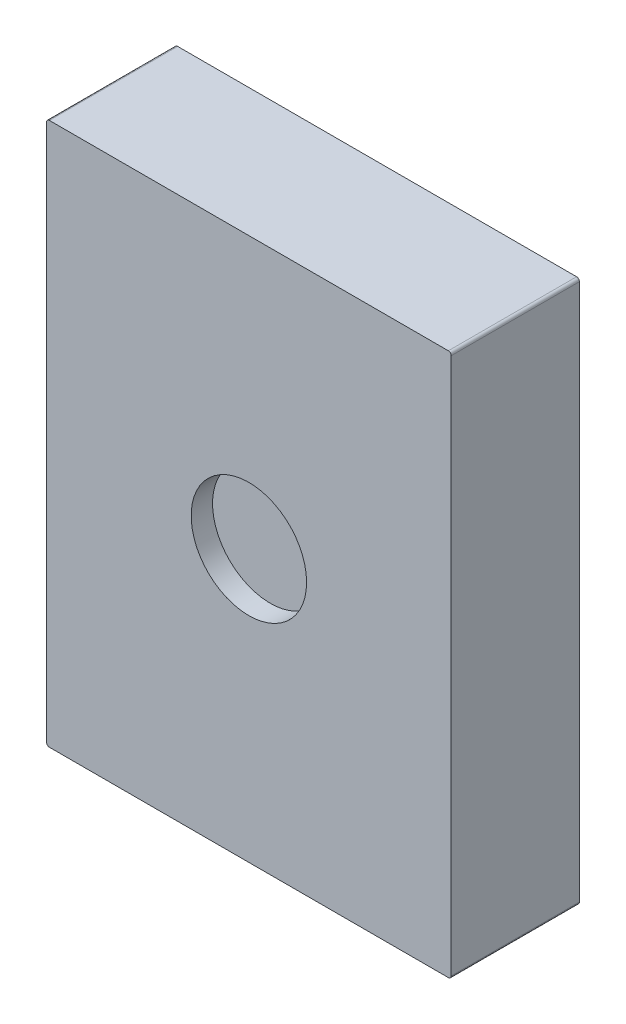
ISO-10303-21;
HEADER;
FILE_DESCRIPTION(('STEP AP214'),'2;1');
FILE_NAME('part.step','',(''),(''),'','','');
FILE_SCHEMA(('AUTOMOTIVE_DESIGN { 1 0 10303 214 1 1 1 1 }'));
ENDSEC;
DATA;
#1=APPLICATION_CONTEXT('core data for automotive mechanical design processes');
#2=APPLICATION_PROTOCOL_DEFINITION('international standard','automotive_design',2000,#1);
#3=PRODUCT_CONTEXT('',#1,'mechanical');
#4=PRODUCT('Part','Part','',(#3));
#5=PRODUCT_RELATED_PRODUCT_CATEGORY('part','',(#4));
#6=PRODUCT_DEFINITION_FORMATION('','',#4);
#7=PRODUCT_DEFINITION_CONTEXT('part definition',#1,'design');
#8=PRODUCT_DEFINITION('design','',#6,#7);
#9=PRODUCT_DEFINITION_SHAPE('','',#8);
#10=(LENGTH_UNIT() NAMED_UNIT(*) SI_UNIT(.MILLI.,.METRE.));
#11=(NAMED_UNIT(*) PLANE_ANGLE_UNIT() SI_UNIT($,.RADIAN.));
#12=(NAMED_UNIT(*) SI_UNIT($,.STERADIAN.) SOLID_ANGLE_UNIT());
#13=UNCERTAINTY_MEASURE_WITH_UNIT(LENGTH_MEASURE(1.E-05),#10,'distance_accuracy_value','');
#14=(GEOMETRIC_REPRESENTATION_CONTEXT(3) GLOBAL_UNCERTAINTY_ASSIGNED_CONTEXT((#13)) GLOBAL_UNIT_ASSIGNED_CONTEXT((#10,
#11,#12)) REPRESENTATION_CONTEXT('',''));
#15=CARTESIAN_POINT('',(0.,0.,0.));
#16=DIRECTION('',(0.,0.,1.));
#17=DIRECTION('',(1.,0.,0.));
#18=AXIS2_PLACEMENT_3D('',#15,#16,#17);
#19=CARTESIAN_POINT('',(-142.,-190.5,60.));
#20=DIRECTION('',(0.,1.,0.));
#21=DIRECTION('',(0.,0.,1.));
#22=AXIS2_PLACEMENT_3D('',#19,#20,#21);
#23=PLANE('',#22);
#24=DIRECTION('',(1.,0.,0.));
#25=VECTOR('',#24,1.);
#26=CARTESIAN_POINT('',(-142.,-190.5,90.));
#27=LINE('',#26,#25);
#28=CARTESIAN_POINT('',(-140.,-190.5,90.));
#29=VERTEX_POINT('',#28);
#30=CARTESIAN_POINT('',(140.,-190.5,90.));
#31=VERTEX_POINT('',#30);
#32=EDGE_CURVE('E206',#29,#31,#27,.T.);
#33=ORIENTED_EDGE('',*,*,#32,.F.);
#34=DIRECTION('',(0.,0.,-1.));
#35=VECTOR('',#34,1.);
#36=CARTESIAN_POINT('',(-140.,-190.5,60.));
#37=LINE('',#36,#35);
#38=CARTESIAN_POINT('',(-140.,-190.5,0.));
#39=VERTEX_POINT('',#38);
#40=EDGE_CURVE('E234',#29,#39,#37,.T.);
#41=ORIENTED_EDGE('',*,*,#40,.T.);
#42=DIRECTION('',(1.,0.,0.));
#43=VECTOR('',#42,1.);
#44=CARTESIAN_POINT('',(-142.,-190.5,0.));
#45=LINE('',#44,#43);
#46=CARTESIAN_POINT('',(140.,-190.5,0.));
#47=VERTEX_POINT('',#46);
#48=EDGE_CURVE('E227',#39,#47,#45,.T.);
#49=ORIENTED_EDGE('',*,*,#48,.T.);
#50=DIRECTION('',(0.,0.,-1.));
#51=VECTOR('',#50,1.);
#52=CARTESIAN_POINT('',(140.,-190.5,60.));
#53=LINE('',#52,#51);
#54=EDGE_CURVE('E231',#47,#31,#53,.F.);
#55=ORIENTED_EDGE('',*,*,#54,.T.);
#56=EDGE_LOOP('',(#33,#41,#49,#55));
#57=FACE_BOUND('',#56,.T.);
#58=DIRECTION('',(1.,0.,0.));
#59=VECTOR('',#58,1.);
#60=CARTESIAN_POINT('',(-142.,-190.5,10.));
#61=LINE('',#60,#59);
#62=CARTESIAN_POINT('',(-132.,-190.5,10.));
#63=VERTEX_POINT('',#62);
#64=CARTESIAN_POINT('',(132.,-190.5,10.));
#65=VERTEX_POINT('',#64);
#66=EDGE_CURVE('E174',#63,#65,#61,.T.);
#67=ORIENTED_EDGE('',*,*,#66,.F.);
#68=DIRECTION('',(0.,0.,-1.));
#69=VECTOR('',#68,1.);
#70=CARTESIAN_POINT('',(-132.,-190.5,60.));
#71=LINE('',#70,#69);
#72=CARTESIAN_POINT('',(-132.,-190.5,80.));
#73=VERTEX_POINT('',#72);
#74=EDGE_CURVE('E187',#73,#63,#71,.T.);
#75=ORIENTED_EDGE('',*,*,#74,.F.);
#76=DIRECTION('',(1.,0.,0.));
#77=VECTOR('',#76,1.);
#78=CARTESIAN_POINT('',(-142.,-190.5,80.));
#79=LINE('',#78,#77);
#80=CARTESIAN_POINT('',(132.,-190.5,80.));
#81=VERTEX_POINT('',#80);
#82=EDGE_CURVE('E159',#73,#81,#79,.T.);
#83=ORIENTED_EDGE('',*,*,#82,.T.);
#84=DIRECTION('',(0.,0.,-1.));
#85=VECTOR('',#84,1.);
#86=CARTESIAN_POINT('',(132.,-190.5,60.));
#87=LINE('',#86,#85);
#88=EDGE_CURVE('E154',#81,#65,#87,.T.);
#89=ORIENTED_EDGE('',*,*,#88,.T.);
#90=EDGE_LOOP('',(#67,#75,#83,#89));
#91=FACE_BOUND('',#90,.T.);
#92=ADVANCED_FACE('F44',(#57,#91),#23,.F.);
#93=CARTESIAN_POINT('',(142.,190.5,60.));
#94=DIRECTION('',(-1.,0.,0.));
#95=DIRECTION('',(0.,-1.,0.));
#96=AXIS2_PLACEMENT_3D('',#93,#94,#95);
#97=PLANE('',#96);
#98=DIRECTION('',(0.,1.,0.));
#99=VECTOR('',#98,1.);
#100=CARTESIAN_POINT('',(142.,190.5,90.));
#101=LINE('',#100,#99);
#102=CARTESIAN_POINT('',(142.,-188.5,90.));
#103=VERTEX_POINT('',#102);
#104=CARTESIAN_POINT('',(142.,188.5,90.));
#105=VERTEX_POINT('',#104);
#106=EDGE_CURVE('E210',#103,#105,#101,.T.);
#107=ORIENTED_EDGE('',*,*,#106,.F.);
#108=DIRECTION('',(0.,0.,-1.));
#109=VECTOR('',#108,1.);
#110=CARTESIAN_POINT('',(142.,-188.5,60.));
#111=LINE('',#110,#109);
#112=CARTESIAN_POINT('',(142.,-188.5,0.));
#113=VERTEX_POINT('',#112);
#114=EDGE_CURVE('E271',#103,#113,#111,.T.);
#115=ORIENTED_EDGE('',*,*,#114,.T.);
#116=DIRECTION('',(0.,1.,0.));
#117=VECTOR('',#116,1.);
#118=CARTESIAN_POINT('',(142.,190.5,0.));
#119=LINE('',#118,#117);
#120=CARTESIAN_POINT('',(142.,188.5,0.));
#121=VERTEX_POINT('',#120);
#122=EDGE_CURVE('E216',#113,#121,#119,.T.);
#123=ORIENTED_EDGE('',*,*,#122,.T.);
#124=DIRECTION('',(0.,0.,-1.));
#125=VECTOR('',#124,1.);
#126=CARTESIAN_POINT('',(142.,188.5,60.));
#127=LINE('',#126,#125);
#128=EDGE_CURVE('E268',#121,#105,#127,.F.);
#129=ORIENTED_EDGE('',*,*,#128,.T.);
#130=EDGE_LOOP('',(#107,#115,#123,#129));
#131=FACE_BOUND('',#130,.T.);
#132=ADVANCED_FACE('F286',(#131),#97,.F.);
#133=CARTESIAN_POINT('',(-142.,190.5,60.));
#134=DIRECTION('',(0.,-1.,0.));
#135=DIRECTION('',(0.,0.,-1.));
#136=AXIS2_PLACEMENT_3D('',#133,#134,#135);
#137=PLANE('',#136);
#138=DIRECTION('',(-1.,0.,0.));
#139=VECTOR('',#138,1.);
#140=CARTESIAN_POINT('',(-142.,190.5,90.));
#141=LINE('',#140,#139);
#142=CARTESIAN_POINT('',(140.,190.5,90.));
#143=VERTEX_POINT('',#142);
#144=CARTESIAN_POINT('',(-140.,190.5,90.));
#145=VERTEX_POINT('',#144);
#146=EDGE_CURVE('E213',#143,#145,#141,.T.);
#147=ORIENTED_EDGE('',*,*,#146,.F.);
#148=DIRECTION('',(0.,0.,-1.));
#149=VECTOR('',#148,1.);
#150=CARTESIAN_POINT('',(140.,190.5,60.));
#151=LINE('',#150,#149);
#152=CARTESIAN_POINT('',(140.,190.5,0.));
#153=VERTEX_POINT('',#152);
#154=EDGE_CURVE('E11',#143,#153,#151,.T.);
#155=ORIENTED_EDGE('',*,*,#154,.T.);
#156=DIRECTION('',(-1.,0.,0.));
#157=VECTOR('',#156,1.);
#158=CARTESIAN_POINT('',(-142.,190.5,0.));
#159=LINE('',#158,#157);
#160=CARTESIAN_POINT('',(-140.,190.5,0.));
#161=VERTEX_POINT('',#160);
#162=EDGE_CURVE('E220',#153,#161,#159,.T.);
#163=ORIENTED_EDGE('',*,*,#162,.T.);
#164=DIRECTION('',(0.,0.,-1.));
#165=VECTOR('',#164,1.);
#166=CARTESIAN_POINT('',(-140.,190.5,60.));
#167=LINE('',#166,#165);
#168=EDGE_CURVE('E53',#161,#145,#167,.F.);
#169=ORIENTED_EDGE('',*,*,#168,.T.);
#170=EDGE_LOOP('',(#147,#155,#163,#169));
#171=FACE_BOUND('',#170,.T.);
#172=ADVANCED_FACE('F293',(#171),#137,.F.);
#173=CARTESIAN_POINT('',(-142.,190.5,60.));
#174=DIRECTION('',(1.,0.,0.));
#175=DIRECTION('',(0.,1.,0.));
#176=AXIS2_PLACEMENT_3D('',#173,#174,#175);
#177=PLANE('',#176);
#178=DIRECTION('',(0.,-1.,0.));
#179=VECTOR('',#178,1.);
#180=CARTESIAN_POINT('',(-142.,190.5,0.));
#181=LINE('',#180,#179);
#182=CARTESIAN_POINT('',(-142.,188.5,0.));
#183=VERTEX_POINT('',#182);
#184=CARTESIAN_POINT('',(-142.,-188.5,0.));
#185=VERTEX_POINT('',#184);
#186=EDGE_CURVE('E223',#183,#185,#181,.T.);
#187=ORIENTED_EDGE('',*,*,#186,.T.);
#188=DIRECTION('',(0.,0.,-1.));
#189=VECTOR('',#188,1.);
#190=CARTESIAN_POINT('',(-142.,-188.5,60.));
#191=LINE('',#190,#189);
#192=CARTESIAN_POINT('',(-142.,-188.5,90.));
#193=VERTEX_POINT('',#192);
#194=EDGE_CURVE('E254',#185,#193,#191,.F.);
#195=ORIENTED_EDGE('',*,*,#194,.T.);
#196=DIRECTION('',(0.,-1.,0.));
#197=VECTOR('',#196,1.);
#198=CARTESIAN_POINT('',(-142.,190.5,90.));
#199=LINE('',#198,#197);
#200=CARTESIAN_POINT('',(-142.,188.5,90.));
#201=VERTEX_POINT('',#200);
#202=EDGE_CURVE('E199',#201,#193,#199,.T.);
#203=ORIENTED_EDGE('',*,*,#202,.F.);
#204=DIRECTION('',(0.,0.,-1.));
#205=VECTOR('',#204,1.);
#206=CARTESIAN_POINT('',(-142.,188.5,60.));
#207=LINE('',#206,#205);
#208=EDGE_CURVE('E250',#201,#183,#207,.T.);
#209=ORIENTED_EDGE('',*,*,#208,.T.);
#210=EDGE_LOOP('',(#187,#195,#203,#209));
#211=FACE_BOUND('',#210,.T.);
#212=ADVANCED_FACE('F301',(#211),#177,.F.);
#213=CARTESIAN_POINT('',(0.,0.,0.));
#214=DIRECTION('',(0.,0.,1.));
#215=DIRECTION('',(1.,0.,0.));
#216=AXIS2_PLACEMENT_3D('',#213,#214,#215);
#217=PLANE('',#216);
#218=ORIENTED_EDGE('',*,*,#48,.F.);
#219=CARTESIAN_POINT('',(-140.,-188.5,0.));
#220=DIRECTION('',(0.,0.,1.));
#221=DIRECTION('',(1.,0.,0.));
#222=AXIS2_PLACEMENT_3D('',#219,#220,#221);
#223=CIRCLE('',#222,2.);
#224=EDGE_CURVE('E247',#39,#185,#223,.F.);
#225=ORIENTED_EDGE('',*,*,#224,.T.);
#226=ORIENTED_EDGE('',*,*,#186,.F.);
#227=CARTESIAN_POINT('',(-140.,188.5,0.));
#228=DIRECTION('',(0.,0.,1.));
#229=DIRECTION('',(1.,0.,0.));
#230=AXIS2_PLACEMENT_3D('',#227,#228,#229);
#231=CIRCLE('',#230,2.);
#232=EDGE_CURVE('E238',#183,#161,#231,.F.);
#233=ORIENTED_EDGE('',*,*,#232,.T.);
#234=ORIENTED_EDGE('',*,*,#162,.F.);
#235=CARTESIAN_POINT('',(140.,188.5,0.));
#236=DIRECTION('',(0.,0.,1.));
#237=DIRECTION('',(1.,0.,0.));
#238=AXIS2_PLACEMENT_3D('',#235,#236,#237);
#239=CIRCLE('',#238,2.);
#240=EDGE_CURVE('E241',#153,#121,#239,.F.);
#241=ORIENTED_EDGE('',*,*,#240,.T.);
#242=ORIENTED_EDGE('',*,*,#122,.F.);
#243=CARTESIAN_POINT('',(140.,-188.5,0.));
#244=DIRECTION('',(0.,0.,1.));
#245=DIRECTION('',(1.,0.,0.));
#246=AXIS2_PLACEMENT_3D('',#243,#244,#245);
#247=CIRCLE('',#246,2.);
#248=EDGE_CURVE('E244',#113,#47,#247,.F.);
#249=ORIENTED_EDGE('',*,*,#248,.T.);
#250=EDGE_LOOP('',(#218,#225,#226,#233,#234,#241,#242,#249));
#251=FACE_BOUND('',#250,.T.);
#252=ADVANCED_FACE('F299',(#251),#217,.F.);
#253=CARTESIAN_POINT('',(0.,0.,90.));
#254=DIRECTION('',(0.,0.,1.));
#255=DIRECTION('',(1.,0.,0.));
#256=AXIS2_PLACEMENT_3D('',#253,#254,#255);
#257=PLANE('',#256);
#258=CARTESIAN_POINT('',(0.,0.,90.));
#259=DIRECTION('',(0.,0.,1.));
#260=DIRECTION('',(1.,0.,0.));
#261=AXIS2_PLACEMENT_3D('',#258,#259,#260);
#262=CIRCLE('',#261,40.5);
#263=CARTESIAN_POINT('',(40.5,0.,90.));
#264=VERTEX_POINT('',#263);
#265=EDGE_CURVE('E147',#264,#264,#262,.T.);
#266=ORIENTED_EDGE('',*,*,#265,.F.);
#267=EDGE_LOOP('',(#266));
#268=FACE_BOUND('',#267,.T.);
#269=ORIENTED_EDGE('',*,*,#202,.T.);
#270=CARTESIAN_POINT('',(-140.,-188.5,90.));
#271=DIRECTION('',(0.,0.,1.));
#272=DIRECTION('',(1.,0.,0.));
#273=AXIS2_PLACEMENT_3D('',#270,#271,#272);
#274=CIRCLE('',#273,2.);
#275=EDGE_CURVE('E265',#193,#29,#274,.T.);
#276=ORIENTED_EDGE('',*,*,#275,.T.);
#277=ORIENTED_EDGE('',*,*,#32,.T.);
#278=CARTESIAN_POINT('',(140.,-188.5,90.));
#279=DIRECTION('',(0.,0.,1.));
#280=DIRECTION('',(1.,0.,0.));
#281=AXIS2_PLACEMENT_3D('',#278,#279,#280);
#282=CIRCLE('',#281,2.);
#283=EDGE_CURVE('E262',#31,#103,#282,.T.);
#284=ORIENTED_EDGE('',*,*,#283,.T.);
#285=ORIENTED_EDGE('',*,*,#106,.T.);
#286=CARTESIAN_POINT('',(140.,188.5,90.));
#287=DIRECTION('',(0.,0.,1.));
#288=DIRECTION('',(1.,0.,0.));
#289=AXIS2_PLACEMENT_3D('',#286,#287,#288);
#290=CIRCLE('',#289,2.);
#291=EDGE_CURVE('E66',#105,#143,#290,.T.);
#292=ORIENTED_EDGE('',*,*,#291,.T.);
#293=ORIENTED_EDGE('',*,*,#146,.T.);
#294=CARTESIAN_POINT('',(-140.,188.5,90.));
#295=DIRECTION('',(0.,0.,1.));
#296=DIRECTION('',(1.,0.,0.));
#297=AXIS2_PLACEMENT_3D('',#294,#295,#296);
#298=CIRCLE('',#297,2.);
#299=EDGE_CURVE('E257',#145,#201,#298,.T.);
#300=ORIENTED_EDGE('',*,*,#299,.T.);
#301=EDGE_LOOP('',(#269,#276,#277,#284,#285,#292,#293,#300));
#302=FACE_BOUND('',#301,.T.);
#303=ADVANCED_FACE('F334',(#268,#302),#257,.T.);
#304=CARTESIAN_POINT('',(0.,0.,75.));
#305=DIRECTION('',(0.,0.,1.));
#306=DIRECTION('',(1.,0.,0.));
#307=AXIS2_PLACEMENT_3D('',#304,#305,#306);
#308=CYLINDRICAL_SURFACE('',#307,40.5);
#309=CARTESIAN_POINT('',(0.,0.,75.));
#310=DIRECTION('',(0.,0.,1.));
#311=DIRECTION('',(1.,0.,0.));
#312=AXIS2_PLACEMENT_3D('',#309,#310,#311);
#313=CIRCLE('',#312,40.5);
#314=CARTESIAN_POINT('',(40.5,0.,75.));
#315=VERTEX_POINT('',#314);
#316=EDGE_CURVE('E195',#315,#315,#313,.T.);
#317=ORIENTED_EDGE('',*,*,#316,.F.);
#318=EDGE_LOOP('',(#317));
#319=FACE_BOUND('',#318,.T.);
#320=ORIENTED_EDGE('',*,*,#265,.T.);
#321=EDGE_LOOP('',(#320));
#322=FACE_BOUND('',#321,.T.);
#323=ADVANCED_FACE('F341',(#319,#322),#308,.F.);
#324=CARTESIAN_POINT('',(0.,0.,75.));
#325=DIRECTION('',(0.,0.,1.));
#326=DIRECTION('',(1.,0.,0.));
#327=AXIS2_PLACEMENT_3D('',#324,#325,#326);
#328=PLANE('',#327);
#329=ORIENTED_EDGE('',*,*,#316,.T.);
#330=EDGE_LOOP('',(#329));
#331=FACE_BOUND('',#330,.T.);
#332=ADVANCED_FACE('F347',(#331),#328,.T.);
#333=CARTESIAN_POINT('',(132.,190.5,60.));
#334=DIRECTION('',(-1.,0.,0.));
#335=DIRECTION('',(0.,-1.,0.));
#336=AXIS2_PLACEMENT_3D('',#333,#334,#335);
#337=PLANE('',#336);
#338=DIRECTION('',(0.,1.,0.));
#339=VECTOR('',#338,1.);
#340=CARTESIAN_POINT('',(132.,190.5,10.));
#341=LINE('',#340,#339);
#342=CARTESIAN_POINT('',(132.,180.5,10.));
#343=VERTEX_POINT('',#342);
#344=EDGE_CURVE('E164',#65,#343,#341,.T.);
#345=ORIENTED_EDGE('',*,*,#344,.F.);
#346=ORIENTED_EDGE('',*,*,#88,.F.);
#347=DIRECTION('',(0.,1.,0.));
#348=VECTOR('',#347,1.);
#349=CARTESIAN_POINT('',(132.,190.5,80.));
#350=LINE('',#349,#348);
#351=CARTESIAN_POINT('',(132.,180.5,80.));
#352=VERTEX_POINT('',#351);
#353=EDGE_CURVE('E151',#81,#352,#350,.T.);
#354=ORIENTED_EDGE('',*,*,#353,.T.);
#355=DIRECTION('',(0.,0.,-1.));
#356=VECTOR('',#355,1.);
#357=CARTESIAN_POINT('',(132.,180.5,60.));
#358=LINE('',#357,#356);
#359=EDGE_CURVE('E135',#352,#343,#358,.T.);
#360=ORIENTED_EDGE('',*,*,#359,.T.);
#361=EDGE_LOOP('',(#345,#346,#354,#360));
#362=FACE_BOUND('',#361,.T.);
#363=ADVANCED_FACE('F152',(#362),#337,.T.);
#364=CARTESIAN_POINT('',(-142.,180.5,60.));
#365=DIRECTION('',(0.,-1.,0.));
#366=DIRECTION('',(0.,0.,-1.));
#367=AXIS2_PLACEMENT_3D('',#364,#365,#366);
#368=PLANE('',#367);
#369=DIRECTION('',(-1.,0.,0.));
#370=VECTOR('',#369,1.);
#371=CARTESIAN_POINT('',(-142.,180.5,10.));
#372=LINE('',#371,#370);
#373=CARTESIAN_POINT('',(-132.,180.5,10.));
#374=VERTEX_POINT('',#373);
#375=EDGE_CURVE('E142',#343,#374,#372,.T.);
#376=ORIENTED_EDGE('',*,*,#375,.F.);
#377=ORIENTED_EDGE('',*,*,#359,.F.);
#378=DIRECTION('',(-1.,0.,0.));
#379=VECTOR('',#378,1.);
#380=CARTESIAN_POINT('',(-142.,180.5,80.));
#381=LINE('',#380,#379);
#382=CARTESIAN_POINT('',(-132.,180.5,80.));
#383=VERTEX_POINT('',#382);
#384=EDGE_CURVE('E140',#352,#383,#381,.T.);
#385=ORIENTED_EDGE('',*,*,#384,.T.);
#386=DIRECTION('',(0.,0.,-1.));
#387=VECTOR('',#386,1.);
#388=CARTESIAN_POINT('',(-132.,180.5,60.));
#389=LINE('',#388,#387);
#390=EDGE_CURVE('E148',#383,#374,#389,.T.);
#391=ORIENTED_EDGE('',*,*,#390,.T.);
#392=EDGE_LOOP('',(#376,#377,#385,#391));
#393=FACE_BOUND('',#392,.T.);
#394=ADVANCED_FACE('F137',(#393),#368,.T.);
#395=CARTESIAN_POINT('',(-132.,190.5,60.));
#396=DIRECTION('',(1.,0.,0.));
#397=DIRECTION('',(0.,1.,0.));
#398=AXIS2_PLACEMENT_3D('',#395,#396,#397);
#399=PLANE('',#398);
#400=DIRECTION('',(0.,-1.,0.));
#401=VECTOR('',#400,1.);
#402=CARTESIAN_POINT('',(-132.,190.5,10.));
#403=LINE('',#402,#401);
#404=EDGE_CURVE('E171',#374,#63,#403,.T.);
#405=ORIENTED_EDGE('',*,*,#404,.F.);
#406=ORIENTED_EDGE('',*,*,#390,.F.);
#407=DIRECTION('',(0.,-1.,0.));
#408=VECTOR('',#407,1.);
#409=CARTESIAN_POINT('',(-132.,190.5,80.));
#410=LINE('',#409,#408);
#411=EDGE_CURVE('E162',#383,#73,#410,.T.);
#412=ORIENTED_EDGE('',*,*,#411,.T.);
#413=ORIENTED_EDGE('',*,*,#74,.T.);
#414=EDGE_LOOP('',(#405,#406,#412,#413));
#415=FACE_BOUND('',#414,.T.);
#416=ADVANCED_FACE('F281',(#415),#399,.T.);
#417=CARTESIAN_POINT('',(0.,0.,10.));
#418=DIRECTION('',(0.,0.,1.));
#419=DIRECTION('',(1.,0.,0.));
#420=AXIS2_PLACEMENT_3D('',#417,#418,#419);
#421=PLANE('',#420);
#422=ORIENTED_EDGE('',*,*,#344,.T.);
#423=ORIENTED_EDGE('',*,*,#375,.T.);
#424=ORIENTED_EDGE('',*,*,#404,.T.);
#425=ORIENTED_EDGE('',*,*,#66,.T.);
#426=EDGE_LOOP('',(#422,#423,#424,#425));
#427=FACE_BOUND('',#426,.T.);
#428=ADVANCED_FACE('F278',(#427),#421,.T.);
#429=CARTESIAN_POINT('',(0.,0.,80.));
#430=DIRECTION('',(0.,0.,1.));
#431=DIRECTION('',(1.,0.,0.));
#432=AXIS2_PLACEMENT_3D('',#429,#430,#431);
#433=PLANE('',#432);
#434=CARTESIAN_POINT('',(0.,0.,80.));
#435=DIRECTION('',(0.,0.,1.));
#436=DIRECTION('',(1.,0.,0.));
#437=AXIS2_PLACEMENT_3D('',#434,#435,#436);
#438=CIRCLE('',#437,50.5);
#439=CARTESIAN_POINT('',(50.5,0.,80.));
#440=VERTEX_POINT('',#439);
#441=EDGE_CURVE('E178',#440,#440,#438,.T.);
#442=ORIENTED_EDGE('',*,*,#441,.T.);
#443=EDGE_LOOP('',(#442));
#444=FACE_BOUND('',#443,.T.);
#445=ORIENTED_EDGE('',*,*,#411,.F.);
#446=ORIENTED_EDGE('',*,*,#384,.F.);
#447=ORIENTED_EDGE('',*,*,#353,.F.);
#448=ORIENTED_EDGE('',*,*,#82,.F.);
#449=EDGE_LOOP('',(#445,#446,#447,#448));
#450=FACE_BOUND('',#449,.T.);
#451=ADVANCED_FACE('F161',(#444,#450),#433,.F.);
#452=CARTESIAN_POINT('',(0.,0.,75.));
#453=DIRECTION('',(0.,0.,1.));
#454=DIRECTION('',(1.,0.,0.));
#455=AXIS2_PLACEMENT_3D('',#452,#453,#454);
#456=CYLINDRICAL_SURFACE('',#455,50.5);
#457=CARTESIAN_POINT('',(0.,0.,65.));
#458=DIRECTION('',(0.,0.,1.));
#459=DIRECTION('',(1.,0.,0.));
#460=AXIS2_PLACEMENT_3D('',#457,#458,#459);
#461=CIRCLE('',#460,50.5);
#462=CARTESIAN_POINT('',(50.5,0.,65.));
#463=VERTEX_POINT('',#462);
#464=EDGE_CURVE('E177',#463,#463,#461,.T.);
#465=ORIENTED_EDGE('',*,*,#464,.T.);
#466=EDGE_LOOP('',(#465));
#467=FACE_BOUND('',#466,.T.);
#468=ORIENTED_EDGE('',*,*,#441,.F.);
#469=EDGE_LOOP('',(#468));
#470=FACE_BOUND('',#469,.T.);
#471=ADVANCED_FACE('F356',(#467,#470),#456,.T.);
#472=CARTESIAN_POINT('',(0.,0.,65.));
#473=DIRECTION('',(0.,0.,1.));
#474=DIRECTION('',(1.,0.,0.));
#475=AXIS2_PLACEMENT_3D('',#472,#473,#474);
#476=PLANE('',#475);
#477=ORIENTED_EDGE('',*,*,#464,.F.);
#478=EDGE_LOOP('',(#477));
#479=FACE_BOUND('',#478,.T.);
#480=ADVANCED_FACE('F311',(#479),#476,.F.);
#481=CARTESIAN_POINT('',(-140.,-188.5,60.));
#482=DIRECTION('',(0.,0.,-1.));
#483=DIRECTION('',(-1.,0.,0.));
#484=AXIS2_PLACEMENT_3D('',#481,#482,#483);
#485=CYLINDRICAL_SURFACE('',#484,2.);
#486=ORIENTED_EDGE('',*,*,#275,.F.);
#487=ORIENTED_EDGE('',*,*,#194,.F.);
#488=ORIENTED_EDGE('',*,*,#224,.F.);
#489=ORIENTED_EDGE('',*,*,#40,.F.);
#490=EDGE_LOOP('',(#486,#487,#488,#489));
#491=FACE_BOUND('',#490,.T.);
#492=ADVANCED_FACE('F307',(#491),#485,.T.);
#493=CARTESIAN_POINT('',(140.,-188.5,60.));
#494=DIRECTION('',(0.,0.,-1.));
#495=DIRECTION('',(-1.,0.,0.));
#496=AXIS2_PLACEMENT_3D('',#493,#494,#495);
#497=CYLINDRICAL_SURFACE('',#496,2.);
#498=ORIENTED_EDGE('',*,*,#283,.F.);
#499=ORIENTED_EDGE('',*,*,#54,.F.);
#500=ORIENTED_EDGE('',*,*,#248,.F.);
#501=ORIENTED_EDGE('',*,*,#114,.F.);
#502=EDGE_LOOP('',(#498,#499,#500,#501));
#503=FACE_BOUND('',#502,.T.);
#504=ADVANCED_FACE('F310',(#503),#497,.T.);
#505=CARTESIAN_POINT('',(140.,188.5,60.));
#506=DIRECTION('',(0.,0.,-1.));
#507=DIRECTION('',(-1.,0.,0.));
#508=AXIS2_PLACEMENT_3D('',#505,#506,#507);
#509=CYLINDRICAL_SURFACE('',#508,2.);
#510=ORIENTED_EDGE('',*,*,#291,.F.);
#511=ORIENTED_EDGE('',*,*,#128,.F.);
#512=ORIENTED_EDGE('',*,*,#240,.F.);
#513=ORIENTED_EDGE('',*,*,#154,.F.);
#514=EDGE_LOOP('',(#510,#511,#512,#513));
#515=FACE_BOUND('',#514,.T.);
#516=ADVANCED_FACE('F314',(#515),#509,.T.);
#517=CARTESIAN_POINT('',(-140.,188.5,60.));
#518=DIRECTION('',(0.,0.,-1.));
#519=DIRECTION('',(-1.,0.,0.));
#520=AXIS2_PLACEMENT_3D('',#517,#518,#519);
#521=CYLINDRICAL_SURFACE('',#520,2.);
#522=ORIENTED_EDGE('',*,*,#299,.F.);
#523=ORIENTED_EDGE('',*,*,#168,.F.);
#524=ORIENTED_EDGE('',*,*,#232,.F.);
#525=ORIENTED_EDGE('',*,*,#208,.F.);
#526=EDGE_LOOP('',(#522,#523,#524,#525));
#527=FACE_BOUND('',#526,.T.);
#528=ADVANCED_FACE('F46',(#527),#521,.T.);
#529=CLOSED_SHELL('',(#92,#132,#172,#212,#252,#303,#323,#332,#363,#394,#416,#428,#451,#471,#480,
#492,#504,#516,#528));
#530=MANIFOLD_SOLID_BREP('B2',#529);
#531=ADVANCED_BREP_SHAPE_REPRESENTATION('',(#18,#530),#14);
#532=SHAPE_DEFINITION_REPRESENTATION(#9,#531);
ENDSEC;
END-ISO-10303-21;
